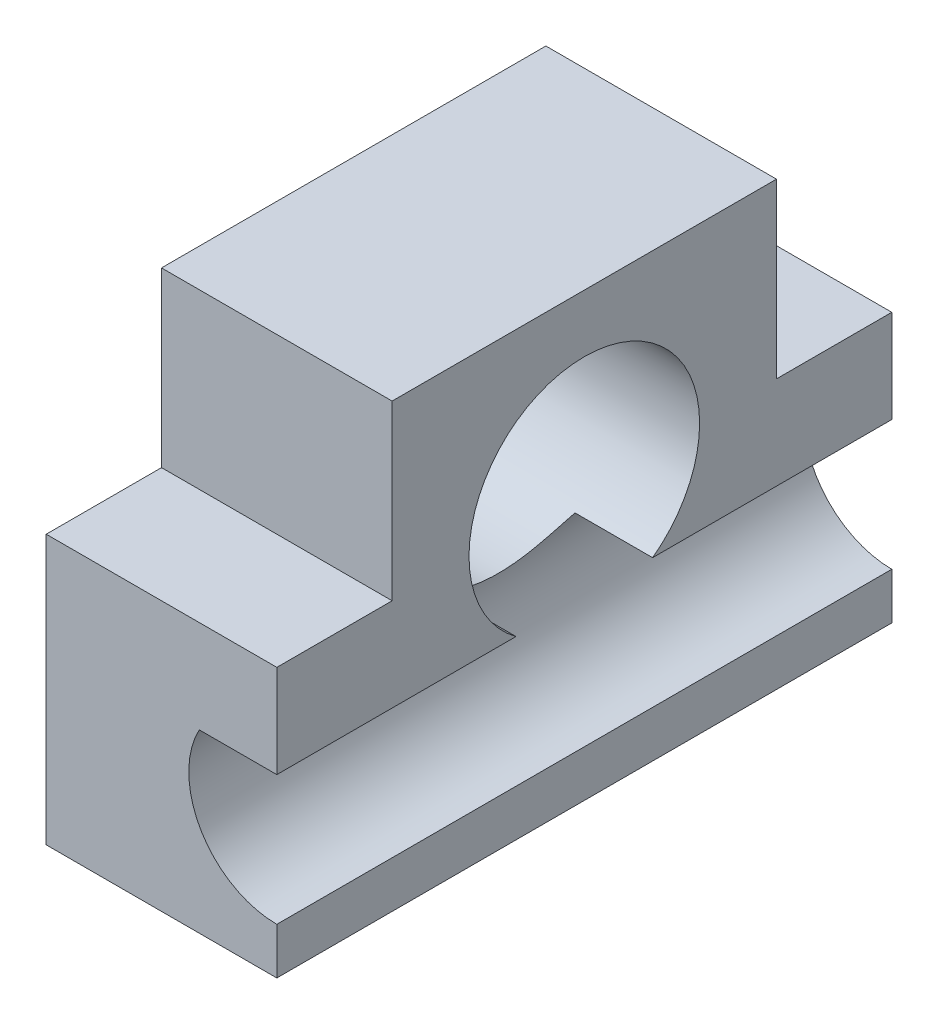
ISO-10303-21;
HEADER;
FILE_DESCRIPTION(('STEP AP214'),'2;1');
FILE_NAME('part.step','',(''),(''),'','','');
FILE_SCHEMA(('AUTOMOTIVE_DESIGN { 1 0 10303 214 1 1 1 1 }'));
ENDSEC;
DATA;
#1=APPLICATION_CONTEXT('core data for automotive mechanical design processes');
#2=APPLICATION_PROTOCOL_DEFINITION('international standard','automotive_design',2000,#1);
#3=PRODUCT_CONTEXT('',#1,'mechanical');
#4=PRODUCT('Part','Part','',(#3));
#5=PRODUCT_RELATED_PRODUCT_CATEGORY('part','',(#4));
#6=PRODUCT_DEFINITION_FORMATION('','',#4);
#7=PRODUCT_DEFINITION_CONTEXT('part definition',#1,'design');
#8=PRODUCT_DEFINITION('design','',#6,#7);
#9=PRODUCT_DEFINITION_SHAPE('','',#8);
#10=(LENGTH_UNIT() NAMED_UNIT(*) SI_UNIT(.MILLI.,.METRE.));
#11=(NAMED_UNIT(*) PLANE_ANGLE_UNIT() SI_UNIT($,.RADIAN.));
#12=(NAMED_UNIT(*) SI_UNIT($,.STERADIAN.) SOLID_ANGLE_UNIT());
#13=UNCERTAINTY_MEASURE_WITH_UNIT(LENGTH_MEASURE(1.E-05),#10,'distance_accuracy_value','');
#14=(GEOMETRIC_REPRESENTATION_CONTEXT(3) GLOBAL_UNCERTAINTY_ASSIGNED_CONTEXT((#13)) GLOBAL_UNIT_ASSIGNED_CONTEXT((#10,
#11,#12)) REPRESENTATION_CONTEXT('',''));
#15=CARTESIAN_POINT('',(0.,0.,0.));
#16=DIRECTION('',(0.,0.,1.));
#17=DIRECTION('',(1.,0.,0.));
#18=AXIS2_PLACEMENT_3D('',#15,#16,#17);
#19=CARTESIAN_POINT('',(-10.089226222793,5.41387238723872,80.));
#20=DIRECTION('',(0.,-1.,0.));
#21=DIRECTION('',(0.,0.,-1.));
#22=AXIS2_PLACEMENT_3D('',#19,#20,#21);
#23=PLANE('',#22);
#24=DIRECTION('',(1.,0.,0.));
#25=VECTOR('',#24,1.);
#26=CARTESIAN_POINT('',(-25.,5.41387238723872,31.1159964358377));
#27=LINE('',#26,#25);
#28=CARTESIAN_POINT('',(-10.089226222793,5.41387238723872,31.1159964358377));
#29=VERTEX_POINT('',#28);
#30=CARTESIAN_POINT('',(0.,5.41387238723872,31.1159964358377));
#31=VERTEX_POINT('',#30);
#32=EDGE_CURVE('E62',#29,#31,#27,.T.);
#33=ORIENTED_EDGE('',*,*,#32,.F.);
#34=DIRECTION('',(0.,0.,-1.));
#35=VECTOR('',#34,1.);
#36=CARTESIAN_POINT('',(-10.089226222793,5.41387238723872,80.));
#37=LINE('',#36,#35);
#38=CARTESIAN_POINT('',(-10.089226222793,5.41387238723872,0.));
#39=VERTEX_POINT('',#38);
#40=EDGE_CURVE('E206',#29,#39,#37,.T.);
#41=ORIENTED_EDGE('',*,*,#40,.T.);
#42=DIRECTION('',(-1.,0.,0.));
#43=VECTOR('',#42,1.);
#44=CARTESIAN_POINT('',(-10.089226222793,5.41387238723872,0.));
#45=LINE('',#44,#43);
#46=CARTESIAN_POINT('',(0.,5.41387238723872,0.));
#47=VERTEX_POINT('',#46);
#48=EDGE_CURVE('E203',#47,#39,#45,.T.);
#49=ORIENTED_EDGE('',*,*,#48,.F.);
#50=DIRECTION('',(0.,0.,-1.));
#51=VECTOR('',#50,1.);
#52=CARTESIAN_POINT('',(0.,5.41387238723872,80.));
#53=LINE('',#52,#51);
#54=EDGE_CURVE('E163',#31,#47,#53,.T.);
#55=ORIENTED_EDGE('',*,*,#54,.F.);
#56=EDGE_LOOP('',(#33,#41,#49,#55));
#57=FACE_BOUND('',#56,.T.);
#58=ADVANCED_FACE('F45',(#57),#23,.T.);
#59=CARTESIAN_POINT('',(-50.,17.5,40.));
#60=DIRECTION('',(1.,0.,0.));
#61=DIRECTION('',(0.,1.,0.));
#62=AXIS2_PLACEMENT_3D('',#59,#60,#61);
#63=CYLINDRICAL_SURFACE('',#62,10.85);
#64=CARTESIAN_POINT('',(-30.,17.5,40.));
#65=DIRECTION('',(1.,0.,0.));
#66=DIRECTION('',(0.,1.,0.));
#67=AXIS2_PLACEMENT_3D('',#64,#65,#66);
#68=CIRCLE('',#67,10.85);
#69=CARTESIAN_POINT('',(-30.,28.35,40.));
#70=VERTEX_POINT('',#69);
#71=EDGE_CURVE('E167',#70,#70,#68,.T.);
#72=ORIENTED_EDGE('',*,*,#71,.F.);
#73=EDGE_LOOP('',(#72));
#74=FACE_BOUND('',#73,.T.);
#75=CARTESIAN_POINT('',(-25.,17.5,40.));
#76=DIRECTION('',(1.,0.,0.));
#77=DIRECTION('',(0.,0.,-1.));
#78=AXIS2_PLACEMENT_3D('',#75,#76,#77);
#79=CIRCLE('',#78,10.85);
#80=CARTESIAN_POINT('',(-25.,17.5,29.15));
#81=VERTEX_POINT('',#80);
#82=EDGE_CURVE('E49',#81,#81,#79,.F.);
#83=ORIENTED_EDGE('',*,*,#82,.F.);
#84=EDGE_LOOP('',(#83));
#85=FACE_BOUND('',#84,.T.);
#86=ADVANCED_FACE('F250',(#74,#85),#63,.F.);
#87=CARTESIAN_POINT('',(-30.,17.5,80.));
#88=DIRECTION('',(0.,-1.,0.));
#89=DIRECTION('',(0.,0.,-1.));
#90=AXIS2_PLACEMENT_3D('',#87,#88,#89);
#91=PLANE('',#90);
#92=DIRECTION('',(1.,0.,0.));
#93=VECTOR('',#92,1.);
#94=CARTESIAN_POINT('',(-30.,17.5,15.));
#95=LINE('',#94,#93);
#96=CARTESIAN_POINT('',(-30.,17.5,15.));
#97=VERTEX_POINT('',#96);
#98=CARTESIAN_POINT('',(0.,17.5,15.));
#99=VERTEX_POINT('',#98);
#100=EDGE_CURVE('E176',#97,#99,#95,.T.);
#101=ORIENTED_EDGE('',*,*,#100,.T.);
#102=DIRECTION('',(0.,0.,-1.));
#103=VECTOR('',#102,1.);
#104=CARTESIAN_POINT('',(0.,17.5,80.));
#105=LINE('',#104,#103);
#106=CARTESIAN_POINT('',(0.,17.5,0.));
#107=VERTEX_POINT('',#106);
#108=EDGE_CURVE('E286',#99,#107,#105,.T.);
#109=ORIENTED_EDGE('',*,*,#108,.T.);
#110=DIRECTION('',(-1.,0.,0.));
#111=VECTOR('',#110,1.);
#112=CARTESIAN_POINT('',(-30.,17.5,0.));
#113=LINE('',#112,#111);
#114=CARTESIAN_POINT('',(-30.,17.5,0.));
#115=VERTEX_POINT('',#114);
#116=EDGE_CURVE('E215',#107,#115,#113,.T.);
#117=ORIENTED_EDGE('',*,*,#116,.T.);
#118=DIRECTION('',(0.,0.,-1.));
#119=VECTOR('',#118,1.);
#120=CARTESIAN_POINT('',(-30.,17.5,80.));
#121=LINE('',#120,#119);
#122=EDGE_CURVE('E239',#97,#115,#121,.T.);
#123=ORIENTED_EDGE('',*,*,#122,.F.);
#124=EDGE_LOOP('',(#101,#109,#117,#123));
#125=FACE_BOUND('',#124,.T.);
#126=ADVANCED_FACE('F253',(#125),#91,.F.);
#127=CARTESIAN_POINT('',(0.,0.,80.));
#128=DIRECTION('',(0.,0.,1.));
#129=DIRECTION('',(1.,0.,0.));
#130=AXIS2_PLACEMENT_3D('',#127,#128,#129);
#131=PLANE('',#130);
#132=DIRECTION('',(0.,-1.,0.));
#133=VECTOR('',#132,1.);
#134=CARTESIAN_POINT('',(0.,0.,80.));
#135=LINE('',#134,#133);
#136=CARTESIAN_POINT('',(0.,17.5,80.));
#137=VERTEX_POINT('',#136);
#138=CARTESIAN_POINT('',(0.,5.41387238723872,80.));
#139=VERTEX_POINT('',#138);
#140=EDGE_CURVE('E160',#137,#139,#135,.T.);
#141=ORIENTED_EDGE('',*,*,#140,.F.);
#142=DIRECTION('',(-1.,0.,0.));
#143=VECTOR('',#142,1.);
#144=CARTESIAN_POINT('',(-30.,17.5,80.));
#145=LINE('',#144,#143);
#146=CARTESIAN_POINT('',(-30.,17.5,80.));
#147=VERTEX_POINT('',#146);
#148=EDGE_CURVE('E216',#137,#147,#145,.T.);
#149=ORIENTED_EDGE('',*,*,#148,.T.);
#150=DIRECTION('',(0.,-1.,0.));
#151=VECTOR('',#150,1.);
#152=CARTESIAN_POINT('',(-30.,17.5,80.));
#153=LINE('',#152,#151);
#154=CARTESIAN_POINT('',(-30.,-17.5,80.));
#155=VERTEX_POINT('',#154);
#156=EDGE_CURVE('E219',#147,#155,#153,.T.);
#157=ORIENTED_EDGE('',*,*,#156,.T.);
#158=DIRECTION('',(1.,0.,0.));
#159=VECTOR('',#158,1.);
#160=CARTESIAN_POINT('',(-30.,-17.5,80.));
#161=LINE('',#160,#159);
#162=CARTESIAN_POINT('',(0.,-17.5,80.));
#163=VERTEX_POINT('',#162);
#164=EDGE_CURVE('E223',#155,#163,#161,.T.);
#165=ORIENTED_EDGE('',*,*,#164,.T.);
#166=CARTESIAN_POINT('',(0.,-11.45,80.));
#167=VERTEX_POINT('',#166);
#168=EDGE_CURVE('E259',#167,#163,#135,.T.);
#169=ORIENTED_EDGE('',*,*,#168,.F.);
#170=CARTESIAN_POINT('',(0.,0.,80.));
#171=DIRECTION('',(0.,0.,1.));
#172=DIRECTION('',(1.,0.,0.));
#173=AXIS2_PLACEMENT_3D('',#170,#171,#172);
#174=CIRCLE('',#173,11.45);
#175=CARTESIAN_POINT('',(-10.089226222793,5.41387238723872,80.));
#176=VERTEX_POINT('',#175);
#177=EDGE_CURVE('E198',#176,#167,#174,.T.);
#178=ORIENTED_EDGE('',*,*,#177,.F.);
#179=DIRECTION('',(-1.,0.,0.));
#180=VECTOR('',#179,1.);
#181=CARTESIAN_POINT('',(-10.089226222793,5.41387238723872,80.));
#182=LINE('',#181,#180);
#183=EDGE_CURVE('E202',#139,#176,#182,.T.);
#184=ORIENTED_EDGE('',*,*,#183,.F.);
#185=EDGE_LOOP('',(#141,#149,#157,#165,#169,#178,#184));
#186=FACE_BOUND('',#185,.T.);
#187=ADVANCED_FACE('F307',(#186),#131,.T.);
#188=CARTESIAN_POINT('',(0.,0.,0.));
#189=DIRECTION('',(0.,0.,1.));
#190=DIRECTION('',(1.,0.,0.));
#191=AXIS2_PLACEMENT_3D('',#188,#189,#190);
#192=PLANE('',#191);
#193=ORIENTED_EDGE('',*,*,#116,.F.);
#194=DIRECTION('',(0.,-1.,0.));
#195=VECTOR('',#194,1.);
#196=CARTESIAN_POINT('',(0.,-17.5,0.));
#197=LINE('',#196,#195);
#198=EDGE_CURVE('E274',#107,#47,#197,.T.);
#199=ORIENTED_EDGE('',*,*,#198,.T.);
#200=ORIENTED_EDGE('',*,*,#48,.T.);
#201=CARTESIAN_POINT('',(0.,0.,0.));
#202=DIRECTION('',(0.,0.,1.));
#203=DIRECTION('',(1.,0.,0.));
#204=AXIS2_PLACEMENT_3D('',#201,#202,#203);
#205=CIRCLE('',#204,11.45);
#206=CARTESIAN_POINT('',(0.,-11.45,0.));
#207=VERTEX_POINT('',#206);
#208=EDGE_CURVE('E197',#39,#207,#205,.T.);
#209=ORIENTED_EDGE('',*,*,#208,.T.);
#210=CARTESIAN_POINT('',(0.,-17.5,0.));
#211=VERTEX_POINT('',#210);
#212=EDGE_CURVE('E69',#207,#211,#197,.T.);
#213=ORIENTED_EDGE('',*,*,#212,.T.);
#214=DIRECTION('',(1.,0.,0.));
#215=VECTOR('',#214,1.);
#216=CARTESIAN_POINT('',(-30.,-17.5,0.));
#217=LINE('',#216,#215);
#218=CARTESIAN_POINT('',(-30.,-17.5,0.));
#219=VERTEX_POINT('',#218);
#220=EDGE_CURVE('E220',#219,#211,#217,.T.);
#221=ORIENTED_EDGE('',*,*,#220,.F.);
#222=DIRECTION('',(0.,-1.,0.));
#223=VECTOR('',#222,1.);
#224=CARTESIAN_POINT('',(-30.,17.5,0.));
#225=LINE('',#224,#223);
#226=EDGE_CURVE('E230',#115,#219,#225,.T.);
#227=ORIENTED_EDGE('',*,*,#226,.F.);
#228=EDGE_LOOP('',(#193,#199,#200,#209,#213,#221,#227));
#229=FACE_BOUND('',#228,.T.);
#230=ADVANCED_FACE('F316',(#229),#192,.F.);
#231=ORIENTED_EDGE('',*,*,#148,.F.);
#232=DIRECTION('',(0.,0.,-1.));
#233=VECTOR('',#232,1.);
#234=CARTESIAN_POINT('',(0.,17.5,80.));
#235=LINE('',#234,#233);
#236=CARTESIAN_POINT('',(0.,17.5,65.));
#237=VERTEX_POINT('',#236);
#238=EDGE_CURVE('E169',#137,#237,#235,.T.);
#239=ORIENTED_EDGE('',*,*,#238,.T.);
#240=DIRECTION('',(-1.,0.,0.));
#241=VECTOR('',#240,1.);
#242=CARTESIAN_POINT('',(-30.,17.5,65.));
#243=LINE('',#242,#241);
#244=CARTESIAN_POINT('',(-30.,17.5,65.));
#245=VERTEX_POINT('',#244);
#246=EDGE_CURVE('E194',#237,#245,#243,.T.);
#247=ORIENTED_EDGE('',*,*,#246,.T.);
#248=EDGE_CURVE('E55',#147,#245,#121,.T.);
#249=ORIENTED_EDGE('',*,*,#248,.F.);
#250=EDGE_LOOP('',(#231,#239,#247,#249));
#251=FACE_BOUND('',#250,.T.);
#252=ADVANCED_FACE('F47',(#251),#91,.F.);
#253=CARTESIAN_POINT('',(-30.,17.5,80.));
#254=DIRECTION('',(1.,0.,0.));
#255=DIRECTION('',(0.,1.,0.));
#256=AXIS2_PLACEMENT_3D('',#253,#254,#255);
#257=PLANE('',#256);
#258=ORIENTED_EDGE('',*,*,#71,.T.);
#259=EDGE_LOOP('',(#258));
#260=FACE_BOUND('',#259,.T.);
#261=DIRECTION('',(0.,-1.,0.));
#262=VECTOR('',#261,1.);
#263=CARTESIAN_POINT('',(-30.,-5.,15.));
#264=LINE('',#263,#262);
#265=CARTESIAN_POINT('',(-30.,40.,15.));
#266=VERTEX_POINT('',#265);
#267=EDGE_CURVE('E177',#266,#97,#264,.T.);
#268=ORIENTED_EDGE('',*,*,#267,.T.);
#269=ORIENTED_EDGE('',*,*,#122,.T.);
#270=ORIENTED_EDGE('',*,*,#226,.T.);
#271=DIRECTION('',(0.,0.,-1.));
#272=VECTOR('',#271,1.);
#273=CARTESIAN_POINT('',(-30.,-17.5,80.));
#274=LINE('',#273,#272);
#275=EDGE_CURVE('E227',#155,#219,#274,.T.);
#276=ORIENTED_EDGE('',*,*,#275,.F.);
#277=ORIENTED_EDGE('',*,*,#156,.F.);
#278=ORIENTED_EDGE('',*,*,#248,.T.);
#279=DIRECTION('',(0.,1.,0.));
#280=VECTOR('',#279,1.);
#281=CARTESIAN_POINT('',(-30.,-5.,65.));
#282=LINE('',#281,#280);
#283=CARTESIAN_POINT('',(-30.,40.,65.));
#284=VERTEX_POINT('',#283);
#285=EDGE_CURVE('E178',#245,#284,#282,.T.);
#286=ORIENTED_EDGE('',*,*,#285,.T.);
#287=DIRECTION('',(0.,0.,-1.));
#288=VECTOR('',#287,1.);
#289=CARTESIAN_POINT('',(-30.,40.,65.));
#290=LINE('',#289,#288);
#291=EDGE_CURVE('E173',#284,#266,#290,.T.);
#292=ORIENTED_EDGE('',*,*,#291,.T.);
#293=EDGE_LOOP('',(#268,#269,#270,#276,#277,#278,#286,#292));
#294=FACE_BOUND('',#293,.T.);
#295=ADVANCED_FACE('F247',(#260,#294),#257,.F.);
#296=CARTESIAN_POINT('',(-30.,-17.5,80.));
#297=DIRECTION('',(0.,1.,0.));
#298=DIRECTION('',(0.,0.,1.));
#299=AXIS2_PLACEMENT_3D('',#296,#297,#298);
#300=PLANE('',#299);
#301=ORIENTED_EDGE('',*,*,#220,.T.);
#302=DIRECTION('',(0.,0.,1.));
#303=VECTOR('',#302,1.);
#304=CARTESIAN_POINT('',(0.,-17.5,0.));
#305=LINE('',#304,#303);
#306=EDGE_CURVE('E280',#211,#163,#305,.T.);
#307=ORIENTED_EDGE('',*,*,#306,.T.);
#308=ORIENTED_EDGE('',*,*,#164,.F.);
#309=ORIENTED_EDGE('',*,*,#275,.T.);
#310=EDGE_LOOP('',(#301,#307,#308,#309));
#311=FACE_BOUND('',#310,.T.);
#312=ADVANCED_FACE('F331',(#311),#300,.F.);
#313=CARTESIAN_POINT('',(0.,0.,80.));
#314=DIRECTION('',(0.,0.,-1.));
#315=DIRECTION('',(-1.,0.,0.));
#316=AXIS2_PLACEMENT_3D('',#313,#314,#315);
#317=CYLINDRICAL_SURFACE('',#316,11.45);
#318=CARTESIAN_POINT('',(-10.089226222793,5.41387238723872,48.8840035641623));
#319=CARTESIAN_POINT('',(-10.1450075107609,5.30991289117944,48.7425879656685));
#320=CARTESIAN_POINT('',(-10.1976942672619,5.20787619548642,48.598557743617));
#321=CARTESIAN_POINT('',(-10.2972796941209,5.0080937693727,48.3056386360084));
#322=CARTESIAN_POINT('',(-10.3441793199221,4.91034733236065,48.1567505576195));
#323=CARTESIAN_POINT('',(-10.4325633404024,4.71965601352426,47.8545975984566));
#324=CARTESIAN_POINT('',(-10.4740533535657,4.62670621149332,47.7013374635386));
#325=CARTESIAN_POINT('',(-10.5520881805207,4.44585528950051,47.3906449404269));
#326=CARTESIAN_POINT('',(-10.5886327966769,4.35795437139062,47.233212385789));
#327=CARTESIAN_POINT('',(-10.6911624113233,4.10305363500737,46.7565641247011));
#328=CARTESIAN_POINT('',(-10.7504422242091,3.94397234219529,46.4316007934847));
#329=CARTESIAN_POINT('',(-10.8541110663213,3.64900316952085,45.7690143040377));
#330=CARTESIAN_POINT('',(-10.8984962669095,3.5131212574278,45.4313879155441));
#331=CARTESIAN_POINT('',(-10.9749729314711,3.26635847332527,44.7471305152723));
#332=CARTESIAN_POINT('',(-11.0071069928744,3.15539153530169,44.4005352628996));
#333=CARTESIAN_POINT('',(-11.0615695009527,2.9588146942613,43.6995214189492));
#334=CARTESIAN_POINT('',(-11.0838986734644,2.87320291440465,43.3451034085156));
#335=CARTESIAN_POINT('',(-11.1205531510558,2.72789690489842,42.630234932401));
#336=CARTESIAN_POINT('',(-11.1348706968047,2.66822781339741,42.2697789656045));
#337=CARTESIAN_POINT('',(-11.156720418113,2.57533639097122,41.5452608432792));
#338=CARTESIAN_POINT('',(-11.1642521410667,2.54211582414626,41.1811984488433));
#339=CARTESIAN_POINT('',(-11.1736931806405,2.50032511156811,40.4144297811092));
#340=CARTESIAN_POINT('',(-11.1749531339497,2.49460403880632,40.0115572244891));
#341=CARTESIAN_POINT('',(-11.1702481247995,2.51558365271285,39.2066770144127));
#342=CARTESIAN_POINT('',(-11.1642826047088,2.54228684174857,38.80466943011));
#343=CARTESIAN_POINT('',(-11.1444277287829,2.62795911618527,38.0038146312708));
#344=CARTESIAN_POINT('',(-11.1305290329785,2.68696623062838,37.6049717047646));
#345=CARTESIAN_POINT('',(-11.0932919208235,2.83678088674251,36.8137635639513));
#346=CARTESIAN_POINT('',(-11.0699540329679,2.92758664798723,36.4213979882608));
#347=CARTESIAN_POINT('',(-11.0110046250162,3.14211425044435,35.6389643226019));
#348=CARTESIAN_POINT('',(-10.9751775735424,3.26640477921498,35.2490678424252));
#349=CARTESIAN_POINT('',(-10.888116691044,3.54581687730789,34.4820884035712));
#350=CARTESIAN_POINT('',(-10.8368787310291,3.70094670551349,34.1050089090768));
#351=CARTESIAN_POINT('',(-10.7153196197466,4.03938576001088,33.3685978366534));
#352=CARTESIAN_POINT('',(-10.6450690188398,4.22258974224407,33.009206337523));
#353=CARTESIAN_POINT('',(-10.4810671195222,4.61462543250849,32.3105793999934));
#354=CARTESIAN_POINT('',(-10.3873400886864,4.82343056355799,31.9713235925358));
#355=CARTESIAN_POINT('',(-10.2500798772596,5.10322065508929,31.5541942844971));
#356=CARTESIAN_POINT('',(-10.2194519493962,5.16431329682251,31.4652220567685));
#357=CARTESIAN_POINT('',(-10.1560072285983,5.28799091565842,31.2891804891422));
#358=CARTESIAN_POINT('',(-10.1231914416516,5.35057519850761,31.2021102987982));
#359=CARTESIAN_POINT('',(-10.089226222793,5.41387238723873,31.1159964358377));
#360=B_SPLINE_CURVE_WITH_KNOTS('',3,(#318,#319,#320,#321,#322,#323,#324,#325,#326,#327,#328,
#329,#330,#331,#332,#333,#334,#335,#336,#337,#338,#339,#340,#341,#342,#343,#344,#345,#346,#347,
#348,#349,#350,#351,#352,#353,#354,#355,#356,#357,#358,#359),.UNSPECIFIED.,.F.,.F.,(4,2,2,2,2,2,
2,2,2,2,2,2,2,2,2,2,2,2,2,2,4),(0.,0.552424327534293,1.104757328578,1.65651202148898,
2.20828875795925,3.30675854173964,4.40551046966931,5.50040639780954,6.59522125928124,
7.69109463139294,8.78704109145732,9.99439395680177,11.2018400064567,12.4107105599601,
13.6195134388573,14.850304014313,16.0814246453382,17.3080381399793,18.5333888801028,
18.8699241257607,19.2063056841339),.UNSPECIFIED.);
#361=CARTESIAN_POINT('',(-10.089226222793,5.41387238723872,48.8840035641623));
#362=VERTEX_POINT('',#361);
#363=EDGE_CURVE('E155',#362,#29,#360,.T.);
#364=ORIENTED_EDGE('',*,*,#363,.F.);
#365=EDGE_CURVE('E153',#176,#362,#37,.T.);
#366=ORIENTED_EDGE('',*,*,#365,.F.);
#367=ORIENTED_EDGE('',*,*,#177,.T.);
#368=DIRECTION('',(0.,0.,-1.));
#369=VECTOR('',#368,1.);
#370=CARTESIAN_POINT('',(0.,-11.45,80.));
#371=LINE('',#370,#369);
#372=EDGE_CURVE('E162',#207,#167,#371,.F.);
#373=ORIENTED_EDGE('',*,*,#372,.F.);
#374=ORIENTED_EDGE('',*,*,#208,.F.);
#375=ORIENTED_EDGE('',*,*,#40,.F.);
#376=EDGE_LOOP('',(#364,#366,#367,#373,#374,#375));
#377=FACE_BOUND('',#376,.T.);
#378=ADVANCED_FACE('F333',(#377),#317,.F.);
#379=DIRECTION('',(1.,0.,0.));
#380=VECTOR('',#379,1.);
#381=CARTESIAN_POINT('',(-25.,5.41387238723872,48.8840035641623));
#382=LINE('',#381,#380);
#383=CARTESIAN_POINT('',(0.,5.41387238723872,48.8840035641623));
#384=VERTEX_POINT('',#383);
#385=EDGE_CURVE('E141',#384,#362,#382,.F.);
#386=ORIENTED_EDGE('',*,*,#385,.F.);
#387=EDGE_CURVE('E150',#139,#384,#53,.T.);
#388=ORIENTED_EDGE('',*,*,#387,.F.);
#389=ORIENTED_EDGE('',*,*,#183,.T.);
#390=ORIENTED_EDGE('',*,*,#365,.T.);
#391=EDGE_LOOP('',(#386,#388,#389,#390));
#392=FACE_BOUND('',#391,.T.);
#393=ADVANCED_FACE('F149',(#392),#23,.T.);
#394=CARTESIAN_POINT('',(-97.2681202353685,-5.,65.));
#395=DIRECTION('',(0.,0.,1.));
#396=DIRECTION('',(1.,0.,0.));
#397=AXIS2_PLACEMENT_3D('',#394,#395,#396);
#398=PLANE('',#397);
#399=DIRECTION('',(0.,-1.,0.));
#400=VECTOR('',#399,1.);
#401=CARTESIAN_POINT('',(0.,-5.,65.));
#402=LINE('',#401,#400);
#403=CARTESIAN_POINT('',(0.,40.,65.));
#404=VERTEX_POINT('',#403);
#405=EDGE_CURVE('E289',#404,#237,#402,.T.);
#406=ORIENTED_EDGE('',*,*,#405,.F.);
#407=DIRECTION('',(1.,0.,0.));
#408=VECTOR('',#407,1.);
#409=CARTESIAN_POINT('',(-97.2681202353685,40.,65.));
#410=LINE('',#409,#408);
#411=EDGE_CURVE('E181',#284,#404,#410,.T.);
#412=ORIENTED_EDGE('',*,*,#411,.F.);
#413=ORIENTED_EDGE('',*,*,#285,.F.);
#414=ORIENTED_EDGE('',*,*,#246,.F.);
#415=EDGE_LOOP('',(#406,#412,#413,#414));
#416=FACE_BOUND('',#415,.T.);
#417=ADVANCED_FACE('F300',(#416),#398,.T.);
#418=CARTESIAN_POINT('',(-97.2681202353685,-5.,15.));
#419=DIRECTION('',(0.,0.,-1.));
#420=DIRECTION('',(-1.,0.,0.));
#421=AXIS2_PLACEMENT_3D('',#418,#419,#420);
#422=PLANE('',#421);
#423=DIRECTION('',(0.,1.,0.));
#424=VECTOR('',#423,1.);
#425=CARTESIAN_POINT('',(0.,-5.,15.));
#426=LINE('',#425,#424);
#427=CARTESIAN_POINT('',(0.,40.,15.));
#428=VERTEX_POINT('',#427);
#429=EDGE_CURVE('E279',#99,#428,#426,.T.);
#430=ORIENTED_EDGE('',*,*,#429,.F.);
#431=ORIENTED_EDGE('',*,*,#100,.F.);
#432=ORIENTED_EDGE('',*,*,#267,.F.);
#433=DIRECTION('',(1.,0.,0.));
#434=VECTOR('',#433,1.);
#435=CARTESIAN_POINT('',(-97.2681202353685,40.,15.));
#436=LINE('',#435,#434);
#437=EDGE_CURVE('E187',#266,#428,#436,.T.);
#438=ORIENTED_EDGE('',*,*,#437,.T.);
#439=EDGE_LOOP('',(#430,#431,#432,#438));
#440=FACE_BOUND('',#439,.T.);
#441=ADVANCED_FACE('F348',(#440),#422,.T.);
#442=CARTESIAN_POINT('',(-97.2681202353685,40.,65.));
#443=DIRECTION('',(0.,1.,0.));
#444=DIRECTION('',(-1.,0.,0.));
#445=AXIS2_PLACEMENT_3D('',#442,#443,#444);
#446=PLANE('',#445);
#447=DIRECTION('',(0.,0.,1.));
#448=VECTOR('',#447,1.);
#449=CARTESIAN_POINT('',(0.,40.,0.));
#450=LINE('',#449,#448);
#451=EDGE_CURVE('E276',#428,#404,#450,.T.);
#452=ORIENTED_EDGE('',*,*,#451,.F.);
#453=ORIENTED_EDGE('',*,*,#437,.F.);
#454=ORIENTED_EDGE('',*,*,#291,.F.);
#455=ORIENTED_EDGE('',*,*,#411,.T.);
#456=EDGE_LOOP('',(#452,#453,#454,#455));
#457=FACE_BOUND('',#456,.T.);
#458=ADVANCED_FACE('F351',(#457),#446,.T.);
#459=CARTESIAN_POINT('',(0.,0.,0.));
#460=DIRECTION('',(-1.,0.,0.));
#461=DIRECTION('',(0.,0.,1.));
#462=AXIS2_PLACEMENT_3D('',#459,#460,#461);
#463=PLANE('',#462);
#464=ORIENTED_EDGE('',*,*,#387,.T.);
#465=CARTESIAN_POINT('',(0.,17.5,40.));
#466=DIRECTION('',(-1.,0.,0.));
#467=DIRECTION('',(0.,0.,1.));
#468=AXIS2_PLACEMENT_3D('',#465,#466,#467);
#469=CIRCLE('',#468,15.);
#470=EDGE_CURVE('E11',#384,#31,#469,.T.);
#471=ORIENTED_EDGE('',*,*,#470,.T.);
#472=ORIENTED_EDGE('',*,*,#54,.T.);
#473=ORIENTED_EDGE('',*,*,#198,.F.);
#474=ORIENTED_EDGE('',*,*,#108,.F.);
#475=ORIENTED_EDGE('',*,*,#429,.T.);
#476=ORIENTED_EDGE('',*,*,#451,.T.);
#477=ORIENTED_EDGE('',*,*,#405,.T.);
#478=ORIENTED_EDGE('',*,*,#238,.F.);
#479=ORIENTED_EDGE('',*,*,#140,.T.);
#480=EDGE_LOOP('',(#464,#471,#472,#473,#474,#475,#476,#477,#478,#479));
#481=FACE_BOUND('',#480,.T.);
#482=ADVANCED_FACE('F158',(#481),#463,.F.);
#483=ORIENTED_EDGE('',*,*,#372,.T.);
#484=ORIENTED_EDGE('',*,*,#168,.T.);
#485=ORIENTED_EDGE('',*,*,#306,.F.);
#486=ORIENTED_EDGE('',*,*,#212,.F.);
#487=EDGE_LOOP('',(#483,#484,#485,#486));
#488=FACE_BOUND('',#487,.T.);
#489=ADVANCED_FACE('F332',(#488),#463,.F.);
#490=CARTESIAN_POINT('',(-25.,17.5,40.));
#491=DIRECTION('',(1.,0.,0.));
#492=DIRECTION('',(0.,0.,-1.));
#493=AXIS2_PLACEMENT_3D('',#490,#491,#492);
#494=PLANE('',#493);
#495=CARTESIAN_POINT('',(-25.,17.5,40.));
#496=DIRECTION('',(1.,0.,0.));
#497=DIRECTION('',(0.,0.,-1.));
#498=AXIS2_PLACEMENT_3D('',#495,#496,#497);
#499=CIRCLE('',#498,15.);
#500=CARTESIAN_POINT('',(-25.,17.5,25.));
#501=VERTEX_POINT('',#500);
#502=EDGE_CURVE('E156',#501,#501,#499,.T.);
#503=ORIENTED_EDGE('',*,*,#502,.T.);
#504=EDGE_LOOP('',(#503));
#505=FACE_BOUND('',#504,.T.);
#506=ORIENTED_EDGE('',*,*,#82,.T.);
#507=EDGE_LOOP('',(#506));
#508=FACE_BOUND('',#507,.T.);
#509=ADVANCED_FACE('F358',(#505,#508),#494,.T.);
#510=CARTESIAN_POINT('',(-25.,17.5,40.));
#511=DIRECTION('',(1.,0.,0.));
#512=DIRECTION('',(0.,0.,-1.));
#513=AXIS2_PLACEMENT_3D('',#510,#511,#512);
#514=CYLINDRICAL_SURFACE('',#513,15.);
#515=ORIENTED_EDGE('',*,*,#32,.T.);
#516=ORIENTED_EDGE('',*,*,#470,.F.);
#517=ORIENTED_EDGE('',*,*,#385,.T.);
#518=ORIENTED_EDGE('',*,*,#363,.T.);
#519=EDGE_LOOP('',(#515,#516,#517,#518));
#520=FACE_BOUND('',#519,.T.);
#521=ORIENTED_EDGE('',*,*,#502,.F.);
#522=EDGE_LOOP('',(#521));
#523=FACE_BOUND('',#522,.T.);
#524=ADVANCED_FACE('F139',(#520,#523),#514,.F.);
#525=CLOSED_SHELL('',(#58,#86,#126,#187,#230,#252,#295,#312,#378,#393,#417,#441,#458,#482,#489,
#509,#524));
#526=MANIFOLD_SOLID_BREP('B2',#525);
#527=ADVANCED_BREP_SHAPE_REPRESENTATION('',(#18,#526),#14);
#528=SHAPE_DEFINITION_REPRESENTATION(#9,#527);
ENDSEC;
END-ISO-10303-21;
